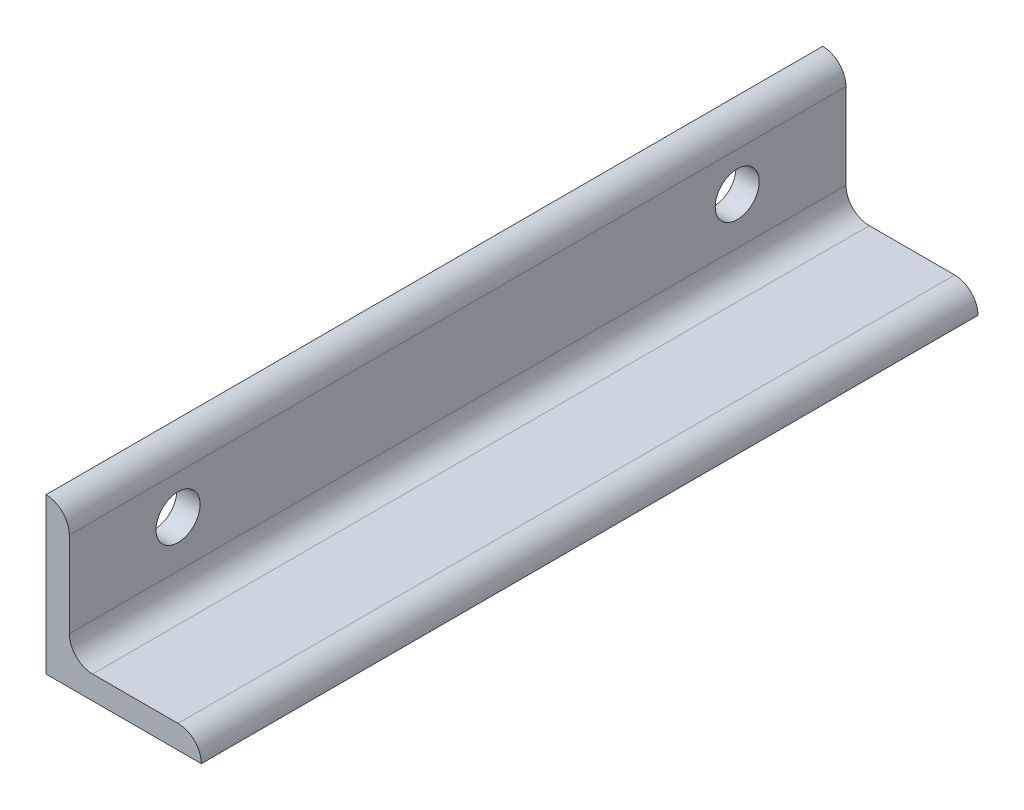
ISO-10303-21;
HEADER;
FILE_DESCRIPTION(('STEP AP214'),'2;1');
FILE_NAME('part.step','',(''),(''),'','','');
FILE_SCHEMA(('AUTOMOTIVE_DESIGN { 1 0 10303 214 1 1 1 1 }'));
ENDSEC;
DATA;
#1=APPLICATION_CONTEXT('core data for automotive mechanical design processes');
#2=APPLICATION_PROTOCOL_DEFINITION('international standard','automotive_design',2000,#1);
#3=PRODUCT_CONTEXT('',#1,'mechanical');
#4=PRODUCT('Part','Part','',(#3));
#5=PRODUCT_RELATED_PRODUCT_CATEGORY('part','',(#4));
#6=PRODUCT_DEFINITION_FORMATION('','',#4);
#7=PRODUCT_DEFINITION_CONTEXT('part definition',#1,'design');
#8=PRODUCT_DEFINITION('design','',#6,#7);
#9=PRODUCT_DEFINITION_SHAPE('','',#8);
#10=(LENGTH_UNIT() NAMED_UNIT(*) SI_UNIT(.MILLI.,.METRE.));
#11=(NAMED_UNIT(*) PLANE_ANGLE_UNIT() SI_UNIT($,.RADIAN.));
#12=(NAMED_UNIT(*) SI_UNIT($,.STERADIAN.) SOLID_ANGLE_UNIT());
#13=UNCERTAINTY_MEASURE_WITH_UNIT(LENGTH_MEASURE(1.E-05),#10,'distance_accuracy_value','');
#14=(GEOMETRIC_REPRESENTATION_CONTEXT(3) GLOBAL_UNCERTAINTY_ASSIGNED_CONTEXT((#13)) GLOBAL_UNIT_ASSIGNED_CONTEXT((#10,
#11,#12)) REPRESENTATION_CONTEXT('',''));
#15=CARTESIAN_POINT('',(0.,0.,0.));
#16=DIRECTION('',(0.,0.,1.));
#17=DIRECTION('',(1.,0.,0.));
#18=AXIS2_PLACEMENT_3D('',#15,#16,#17);
#19=CARTESIAN_POINT('',(0.,0.,79.375));
#20=DIRECTION('',(0.,1.,0.));
#21=DIRECTION('',(-1.,0.,0.));
#22=AXIS2_PLACEMENT_3D('',#19,#20,#21);
#23=PLANE('',#22);
#24=DIRECTION('',(1.,0.,0.));
#25=VECTOR('',#24,1.);
#26=CARTESIAN_POINT('',(0.,0.,-79.375));
#27=LINE('',#26,#25);
#28=CARTESIAN_POINT('',(0.,0.,-79.375));
#29=VERTEX_POINT('',#28);
#30=CARTESIAN_POINT('',(31.75,0.,-79.375));
#31=VERTEX_POINT('',#30);
#32=EDGE_CURVE('E124',#29,#31,#27,.T.);
#33=ORIENTED_EDGE('',*,*,#32,.T.);
#34=DIRECTION('',(0.,0.,-1.));
#35=VECTOR('',#34,1.);
#36=CARTESIAN_POINT('',(31.75,0.,79.375));
#37=LINE('',#36,#35);
#38=CARTESIAN_POINT('',(31.75,0.,79.375));
#39=VERTEX_POINT('',#38);
#40=EDGE_CURVE('E11',#39,#31,#37,.T.);
#41=ORIENTED_EDGE('',*,*,#40,.F.);
#42=DIRECTION('',(1.,0.,0.));
#43=VECTOR('',#42,1.);
#44=CARTESIAN_POINT('',(0.,0.,79.375));
#45=LINE('',#44,#43);
#46=CARTESIAN_POINT('',(0.,0.,79.375));
#47=VERTEX_POINT('',#46);
#48=EDGE_CURVE('E85',#47,#39,#45,.T.);
#49=ORIENTED_EDGE('',*,*,#48,.F.);
#50=DIRECTION('',(0.,0.,-1.));
#51=VECTOR('',#50,1.);
#52=CARTESIAN_POINT('',(0.,0.,79.375));
#53=LINE('',#52,#51);
#54=EDGE_CURVE('E50',#47,#29,#53,.T.);
#55=ORIENTED_EDGE('',*,*,#54,.T.);
#56=EDGE_LOOP('',(#33,#41,#49,#55));
#57=FACE_BOUND('',#56,.T.);
#58=ADVANCED_FACE('F34',(#57),#23,.F.);
#59=CARTESIAN_POINT('',(26.9875,0.,79.375));
#60=DIRECTION('',(0.,0.,-1.));
#61=DIRECTION('',(-1.,0.,0.));
#62=AXIS2_PLACEMENT_3D('',#59,#60,#61);
#63=CYLINDRICAL_SURFACE('',#62,4.7625);
#64=CARTESIAN_POINT('',(26.9875,0.,-79.375));
#65=DIRECTION('',(0.,0.,-1.));
#66=DIRECTION('',(-1.,0.,0.));
#67=AXIS2_PLACEMENT_3D('',#64,#65,#66);
#68=CIRCLE('',#67,4.7625);
#69=CARTESIAN_POINT('',(26.9875,4.7625,-79.375));
#70=VERTEX_POINT('',#69);
#71=EDGE_CURVE('E126',#70,#31,#68,.T.);
#72=ORIENTED_EDGE('',*,*,#71,.F.);
#73=DIRECTION('',(0.,0.,-1.));
#74=VECTOR('',#73,1.);
#75=CARTESIAN_POINT('',(26.9875,4.7625,79.375));
#76=LINE('',#75,#74);
#77=CARTESIAN_POINT('',(26.9875,4.7625,79.375));
#78=VERTEX_POINT('',#77);
#79=EDGE_CURVE('E42',#78,#70,#76,.T.);
#80=ORIENTED_EDGE('',*,*,#79,.F.);
#81=CARTESIAN_POINT('',(26.9875,0.,79.375));
#82=DIRECTION('',(0.,0.,-1.));
#83=DIRECTION('',(-1.,0.,0.));
#84=AXIS2_PLACEMENT_3D('',#81,#82,#83);
#85=CIRCLE('',#84,4.7625);
#86=EDGE_CURVE('E158',#78,#39,#85,.T.);
#87=ORIENTED_EDGE('',*,*,#86,.T.);
#88=ORIENTED_EDGE('',*,*,#40,.T.);
#89=EDGE_LOOP('',(#72,#80,#87,#88));
#90=FACE_BOUND('',#89,.T.);
#91=ADVANCED_FACE('F157',(#90),#63,.T.);
#92=CARTESIAN_POINT('',(26.9875,4.7625,79.375));
#93=DIRECTION('',(0.,-1.,0.));
#94=DIRECTION('',(1.,0.,0.));
#95=AXIS2_PLACEMENT_3D('',#92,#93,#94);
#96=PLANE('',#95);
#97=DIRECTION('',(-1.,0.,0.));
#98=VECTOR('',#97,1.);
#99=CARTESIAN_POINT('',(26.9875,4.7625,-79.375));
#100=LINE('',#99,#98);
#101=CARTESIAN_POINT('',(9.525,4.76249999999999,-79.375));
#102=VERTEX_POINT('',#101);
#103=EDGE_CURVE('E130',#70,#102,#100,.T.);
#104=ORIENTED_EDGE('',*,*,#103,.T.);
#105=DIRECTION('',(0.,0.,-1.));
#106=VECTOR('',#105,1.);
#107=CARTESIAN_POINT('',(9.525,4.76249999999999,79.375));
#108=LINE('',#107,#106);
#109=CARTESIAN_POINT('',(9.525,4.76249999999999,79.375));
#110=VERTEX_POINT('',#109);
#111=EDGE_CURVE('E145',#110,#102,#108,.T.);
#112=ORIENTED_EDGE('',*,*,#111,.F.);
#113=DIRECTION('',(-1.,0.,0.));
#114=VECTOR('',#113,1.);
#115=CARTESIAN_POINT('',(26.9875,4.7625,79.375));
#116=LINE('',#115,#114);
#117=EDGE_CURVE('E119',#78,#110,#116,.T.);
#118=ORIENTED_EDGE('',*,*,#117,.F.);
#119=ORIENTED_EDGE('',*,*,#79,.T.);
#120=EDGE_LOOP('',(#104,#112,#118,#119));
#121=FACE_BOUND('',#120,.T.);
#122=ADVANCED_FACE('F149',(#121),#96,.F.);
#123=CARTESIAN_POINT('',(9.525,9.52499999999999,79.375));
#124=DIRECTION('',(0.,0.,-1.));
#125=DIRECTION('',(-1.,0.,0.));
#126=AXIS2_PLACEMENT_3D('',#123,#124,#125);
#127=CYLINDRICAL_SURFACE('',#126,4.7625);
#128=CARTESIAN_POINT('',(9.525,9.52499999999999,-79.375));
#129=DIRECTION('',(0.,0.,1.));
#130=DIRECTION('',(1.,0.,0.));
#131=AXIS2_PLACEMENT_3D('',#128,#129,#130);
#132=CIRCLE('',#131,4.7625);
#133=CARTESIAN_POINT('',(4.7625,9.52499999999999,-79.375));
#134=VERTEX_POINT('',#133);
#135=EDGE_CURVE('E133',#134,#102,#132,.T.);
#136=ORIENTED_EDGE('',*,*,#135,.F.);
#137=DIRECTION('',(0.,0.,-1.));
#138=VECTOR('',#137,1.);
#139=CARTESIAN_POINT('',(4.7625,9.52499999999999,79.375));
#140=LINE('',#139,#138);
#141=CARTESIAN_POINT('',(4.7625,9.52499999999999,79.375));
#142=VERTEX_POINT('',#141);
#143=EDGE_CURVE('E108',#142,#134,#140,.T.);
#144=ORIENTED_EDGE('',*,*,#143,.F.);
#145=CARTESIAN_POINT('',(9.525,9.52499999999999,79.375));
#146=DIRECTION('',(0.,0.,1.));
#147=DIRECTION('',(1.,0.,0.));
#148=AXIS2_PLACEMENT_3D('',#145,#146,#147);
#149=CIRCLE('',#148,4.7625);
#150=EDGE_CURVE('E117',#142,#110,#149,.T.);
#151=ORIENTED_EDGE('',*,*,#150,.T.);
#152=ORIENTED_EDGE('',*,*,#111,.T.);
#153=EDGE_LOOP('',(#136,#144,#151,#152));
#154=FACE_BOUND('',#153,.T.);
#155=ADVANCED_FACE('F179',(#154),#127,.F.);
#156=CARTESIAN_POINT('',(4.76249999999999,26.9875,79.375));
#157=DIRECTION('',(1.,0.,0.));
#158=DIRECTION('',(0.,1.,0.));
#159=AXIS2_PLACEMENT_3D('',#156,#157,#158);
#160=PLANE('',#159);
#161=CARTESIAN_POINT('',(4.7625,19.05,-57.15));
#162=DIRECTION('',(1.,0.,0.));
#163=DIRECTION('',(0.,1.,0.));
#164=AXIS2_PLACEMENT_3D('',#161,#162,#163);
#165=CIRCLE('',#164,4.5);
#166=CARTESIAN_POINT('',(4.76249999999999,23.55,-57.15));
#167=VERTEX_POINT('',#166);
#168=EDGE_CURVE('E192',#167,#167,#165,.T.);
#169=ORIENTED_EDGE('',*,*,#168,.F.);
#170=EDGE_LOOP('',(#169));
#171=FACE_BOUND('',#170,.T.);
#172=CARTESIAN_POINT('',(4.7625,19.05,57.15));
#173=DIRECTION('',(1.,0.,0.));
#174=DIRECTION('',(0.,1.,0.));
#175=AXIS2_PLACEMENT_3D('',#172,#173,#174);
#176=CIRCLE('',#175,4.5);
#177=CARTESIAN_POINT('',(4.76249999999999,23.55,57.15));
#178=VERTEX_POINT('',#177);
#179=EDGE_CURVE('E127',#178,#178,#176,.T.);
#180=ORIENTED_EDGE('',*,*,#179,.F.);
#181=EDGE_LOOP('',(#180));
#182=FACE_BOUND('',#181,.T.);
#183=DIRECTION('',(0.,-1.,0.));
#184=VECTOR('',#183,1.);
#185=CARTESIAN_POINT('',(4.76249999999999,26.9875,-79.375));
#186=LINE('',#185,#184);
#187=CARTESIAN_POINT('',(4.76249999999999,26.9875,-79.375));
#188=VERTEX_POINT('',#187);
#189=EDGE_CURVE('E105',#188,#134,#186,.T.);
#190=ORIENTED_EDGE('',*,*,#189,.F.);
#191=DIRECTION('',(0.,0.,-1.));
#192=VECTOR('',#191,1.);
#193=CARTESIAN_POINT('',(4.76249999999999,26.9875,79.375));
#194=LINE('',#193,#192);
#195=CARTESIAN_POINT('',(4.76249999999999,26.9875,79.375));
#196=VERTEX_POINT('',#195);
#197=EDGE_CURVE('E99',#196,#188,#194,.T.);
#198=ORIENTED_EDGE('',*,*,#197,.F.);
#199=DIRECTION('',(0.,-1.,0.));
#200=VECTOR('',#199,1.);
#201=CARTESIAN_POINT('',(4.76249999999999,26.9875,79.375));
#202=LINE('',#201,#200);
#203=EDGE_CURVE('E103',#196,#142,#202,.T.);
#204=ORIENTED_EDGE('',*,*,#203,.T.);
#205=ORIENTED_EDGE('',*,*,#143,.T.);
#206=EDGE_LOOP('',(#190,#198,#204,#205));
#207=FACE_BOUND('',#206,.T.);
#208=ADVANCED_FACE('F101',(#171,#182,#207),#160,.T.);
#209=CARTESIAN_POINT('',(0.,26.9875,79.375));
#210=DIRECTION('',(0.,0.,-1.));
#211=DIRECTION('',(-1.,0.,0.));
#212=AXIS2_PLACEMENT_3D('',#209,#210,#211);
#213=CYLINDRICAL_SURFACE('',#212,4.7625);
#214=CARTESIAN_POINT('',(0.,26.9875,-79.375));
#215=DIRECTION('',(0.,0.,1.));
#216=DIRECTION('',(1.,0.,0.));
#217=AXIS2_PLACEMENT_3D('',#214,#215,#216);
#218=CIRCLE('',#217,4.7625);
#219=CARTESIAN_POINT('',(0.,31.75,-79.375));
#220=VERTEX_POINT('',#219);
#221=EDGE_CURVE('E137',#188,#220,#218,.T.);
#222=ORIENTED_EDGE('',*,*,#221,.T.);
#223=DIRECTION('',(0.,0.,-1.));
#224=VECTOR('',#223,1.);
#225=CARTESIAN_POINT('',(0.,31.75,79.375));
#226=LINE('',#225,#224);
#227=CARTESIAN_POINT('',(0.,31.75,79.375));
#228=VERTEX_POINT('',#227);
#229=EDGE_CURVE('E73',#228,#220,#226,.T.);
#230=ORIENTED_EDGE('',*,*,#229,.F.);
#231=CARTESIAN_POINT('',(0.,26.9875,79.375));
#232=DIRECTION('',(0.,0.,1.));
#233=DIRECTION('',(1.,0.,0.));
#234=AXIS2_PLACEMENT_3D('',#231,#232,#233);
#235=CIRCLE('',#234,4.7625);
#236=EDGE_CURVE('E110',#196,#228,#235,.T.);
#237=ORIENTED_EDGE('',*,*,#236,.F.);
#238=ORIENTED_EDGE('',*,*,#197,.T.);
#239=EDGE_LOOP('',(#222,#230,#237,#238));
#240=FACE_BOUND('',#239,.T.);
#241=ADVANCED_FACE('F111',(#240),#213,.T.);
#242=CARTESIAN_POINT('',(0.,0.,79.375));
#243=DIRECTION('',(-1.,0.,0.));
#244=DIRECTION('',(0.,-1.,0.));
#245=AXIS2_PLACEMENT_3D('',#242,#243,#244);
#246=PLANE('',#245);
#247=CARTESIAN_POINT('',(0.,19.05,-57.15));
#248=DIRECTION('',(-1.,0.,0.));
#249=DIRECTION('',(0.,0.,1.));
#250=AXIS2_PLACEMENT_3D('',#247,#248,#249);
#251=CIRCLE('',#250,4.5);
#252=CARTESIAN_POINT('',(0.,19.05,-52.65));
#253=VERTEX_POINT('',#252);
#254=EDGE_CURVE('E204',#253,#253,#251,.T.);
#255=ORIENTED_EDGE('',*,*,#254,.F.);
#256=EDGE_LOOP('',(#255));
#257=FACE_BOUND('',#256,.T.);
#258=CARTESIAN_POINT('',(0.,19.05,57.15));
#259=DIRECTION('',(-1.,0.,0.));
#260=DIRECTION('',(0.,0.,1.));
#261=AXIS2_PLACEMENT_3D('',#258,#259,#260);
#262=CIRCLE('',#261,4.5);
#263=CARTESIAN_POINT('',(0.,19.05,61.65));
#264=VERTEX_POINT('',#263);
#265=EDGE_CURVE('E196',#264,#264,#262,.T.);
#266=ORIENTED_EDGE('',*,*,#265,.F.);
#267=EDGE_LOOP('',(#266));
#268=FACE_BOUND('',#267,.T.);
#269=DIRECTION('',(0.,1.,0.));
#270=VECTOR('',#269,1.);
#271=CARTESIAN_POINT('',(0.,0.,-79.375));
#272=LINE('',#271,#270);
#273=EDGE_CURVE('E139',#29,#220,#272,.T.);
#274=ORIENTED_EDGE('',*,*,#273,.F.);
#275=ORIENTED_EDGE('',*,*,#54,.F.);
#276=DIRECTION('',(0.,1.,0.));
#277=VECTOR('',#276,1.);
#278=CARTESIAN_POINT('',(0.,0.,79.375));
#279=LINE('',#278,#277);
#280=EDGE_CURVE('E112',#47,#228,#279,.T.);
#281=ORIENTED_EDGE('',*,*,#280,.T.);
#282=ORIENTED_EDGE('',*,*,#229,.T.);
#283=EDGE_LOOP('',(#274,#275,#281,#282));
#284=FACE_BOUND('',#283,.T.);
#285=ADVANCED_FACE('F159',(#257,#268,#284),#246,.T.);
#286=CARTESIAN_POINT('',(26.9875,0.,79.375));
#287=DIRECTION('',(0.,0.,-1.));
#288=DIRECTION('',(-1.,0.,0.));
#289=AXIS2_PLACEMENT_3D('',#286,#287,#288);
#290=PLANE('',#289);
#291=ORIENTED_EDGE('',*,*,#48,.T.);
#292=ORIENTED_EDGE('',*,*,#86,.F.);
#293=ORIENTED_EDGE('',*,*,#117,.T.);
#294=ORIENTED_EDGE('',*,*,#150,.F.);
#295=ORIENTED_EDGE('',*,*,#203,.F.);
#296=ORIENTED_EDGE('',*,*,#236,.T.);
#297=ORIENTED_EDGE('',*,*,#280,.F.);
#298=EDGE_LOOP('',(#291,#292,#293,#294,#295,#296,#297));
#299=FACE_BOUND('',#298,.T.);
#300=ADVANCED_FACE('F115',(#299),#290,.F.);
#301=CARTESIAN_POINT('',(26.9875,0.,-79.375));
#302=DIRECTION('',(0.,0.,-1.));
#303=DIRECTION('',(-1.,0.,0.));
#304=AXIS2_PLACEMENT_3D('',#301,#302,#303);
#305=PLANE('',#304);
#306=ORIENTED_EDGE('',*,*,#32,.F.);
#307=ORIENTED_EDGE('',*,*,#273,.T.);
#308=ORIENTED_EDGE('',*,*,#221,.F.);
#309=ORIENTED_EDGE('',*,*,#189,.T.);
#310=ORIENTED_EDGE('',*,*,#135,.T.);
#311=ORIENTED_EDGE('',*,*,#103,.F.);
#312=ORIENTED_EDGE('',*,*,#71,.T.);
#313=EDGE_LOOP('',(#306,#307,#308,#309,#310,#311,#312));
#314=FACE_BOUND('',#313,.T.);
#315=ADVANCED_FACE('F155',(#314),#305,.T.);
#316=CARTESIAN_POINT('',(0.,19.05,57.15));
#317=DIRECTION('',(-1.,0.,0.));
#318=DIRECTION('',(0.,0.,1.));
#319=AXIS2_PLACEMENT_3D('',#316,#317,#318);
#320=CYLINDRICAL_SURFACE('',#319,4.5);
#321=ORIENTED_EDGE('',*,*,#179,.T.);
#322=EDGE_LOOP('',(#321));
#323=FACE_BOUND('',#322,.T.);
#324=ORIENTED_EDGE('',*,*,#265,.T.);
#325=EDGE_LOOP('',(#324));
#326=FACE_BOUND('',#325,.T.);
#327=ADVANCED_FACE('F209',(#323,#326),#320,.F.);
#328=CARTESIAN_POINT('',(0.,19.05,-57.15));
#329=DIRECTION('',(-1.,0.,0.));
#330=DIRECTION('',(0.,0.,1.));
#331=AXIS2_PLACEMENT_3D('',#328,#329,#330);
#332=CYLINDRICAL_SURFACE('',#331,4.5);
#333=ORIENTED_EDGE('',*,*,#168,.T.);
#334=EDGE_LOOP('',(#333));
#335=FACE_BOUND('',#334,.T.);
#336=ORIENTED_EDGE('',*,*,#254,.T.);
#337=EDGE_LOOP('',(#336));
#338=FACE_BOUND('',#337,.T.);
#339=ADVANCED_FACE('F207',(#335,#338),#332,.F.);
#340=CLOSED_SHELL('',(#58,#91,#122,#155,#208,#241,#285,#300,#315,#327,#339));
#341=MANIFOLD_SOLID_BREP('B2',#340);
#342=ADVANCED_BREP_SHAPE_REPRESENTATION('',(#18,#341),#14);
#343=SHAPE_DEFINITION_REPRESENTATION(#9,#342);
ENDSEC;
END-ISO-10303-21;
